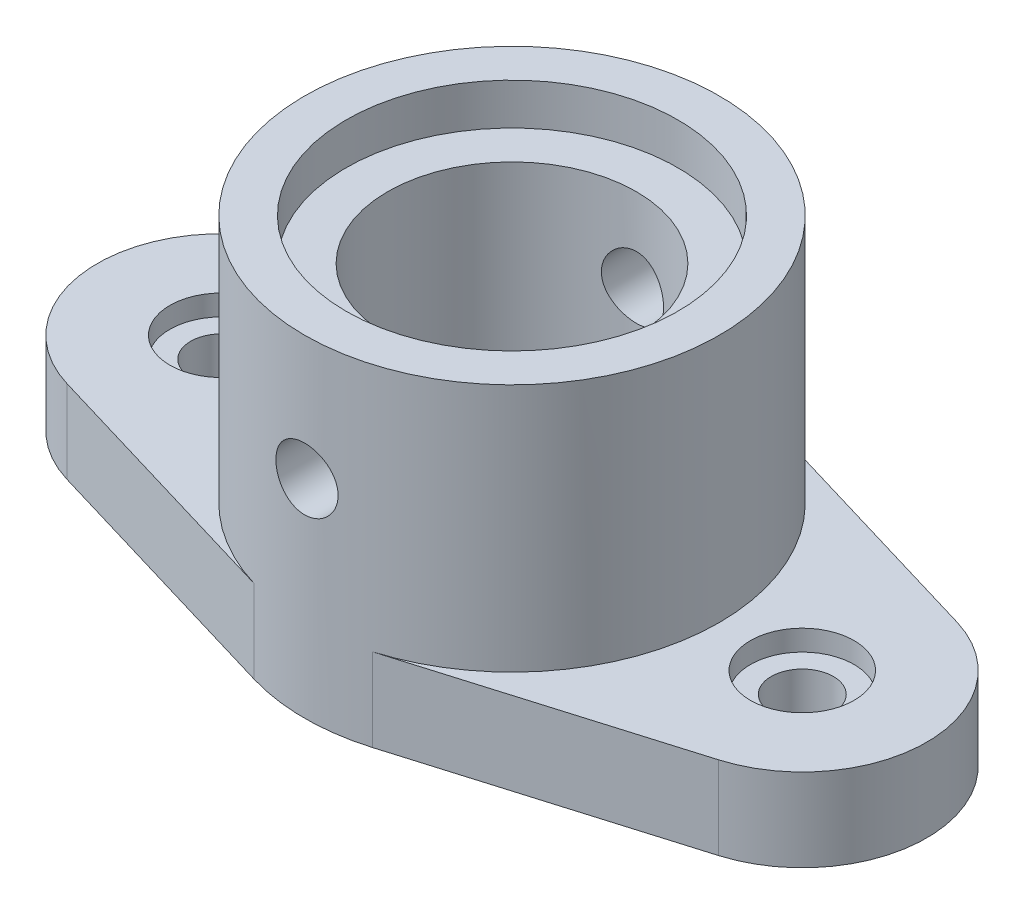
ISO-10303-21;
HEADER;
FILE_DESCRIPTION(('STEP AP214'),'2;1');
FILE_NAME('part.step','',(''),(''),'','','');
FILE_SCHEMA(('AUTOMOTIVE_DESIGN { 1 0 10303 214 1 1 1 1 }'));
ENDSEC;
DATA;
#1=APPLICATION_CONTEXT('core data for automotive mechanical design processes');
#2=APPLICATION_PROTOCOL_DEFINITION('international standard','automotive_design',2000,#1);
#3=PRODUCT_CONTEXT('',#1,'mechanical');
#4=PRODUCT('Part','Part','',(#3));
#5=PRODUCT_RELATED_PRODUCT_CATEGORY('part','',(#4));
#6=PRODUCT_DEFINITION_FORMATION('','',#4);
#7=PRODUCT_DEFINITION_CONTEXT('part definition',#1,'design');
#8=PRODUCT_DEFINITION('design','',#6,#7);
#9=PRODUCT_DEFINITION_SHAPE('','',#8);
#10=(LENGTH_UNIT() NAMED_UNIT(*) SI_UNIT(.MILLI.,.METRE.));
#11=(NAMED_UNIT(*) PLANE_ANGLE_UNIT() SI_UNIT($,.RADIAN.));
#12=(NAMED_UNIT(*) SI_UNIT($,.STERADIAN.) SOLID_ANGLE_UNIT());
#13=UNCERTAINTY_MEASURE_WITH_UNIT(LENGTH_MEASURE(1.E-05),#10,'distance_accuracy_value','');
#14=(GEOMETRIC_REPRESENTATION_CONTEXT(3) GLOBAL_UNCERTAINTY_ASSIGNED_CONTEXT((#13)) GLOBAL_UNIT_ASSIGNED_CONTEXT((#10,
#11,#12)) REPRESENTATION_CONTEXT('',''));
#15=CARTESIAN_POINT('',(0.,0.,0.));
#16=DIRECTION('',(0.,0.,1.));
#17=DIRECTION('',(1.,0.,0.));
#18=AXIS2_PLACEMENT_3D('',#15,#16,#17);
#19=CARTESIAN_POINT('',(0.,12.7,0.));
#20=DIRECTION('',(0.,-1.,0.));
#21=DIRECTION('',(0.,0.,-1.));
#22=AXIS2_PLACEMENT_3D('',#19,#20,#21);
#23=CYLINDRICAL_SURFACE('',#22,19.05);
#24=CARTESIAN_POINT('',(0.,36.5125,-19.05));
#25=CARTESIAN_POINT('',(-0.263131581526395,36.5124926157813,-19.0499955508094));
#26=CARTESIAN_POINT('',(-0.526345651112671,36.4906193262932,-19.0444938556855));
#27=CARTESIAN_POINT('',(-1.04523007797144,36.4038351446002,-19.0230796140991));
#28=CARTESIAN_POINT('',(-1.30089607381459,36.3388998597173,-19.0071611670842));
#29=CARTESIAN_POINT('',(-1.79711626917968,36.1682053702579,-18.966676136042));
#30=CARTESIAN_POINT('',(-2.03768821389025,36.062495189079,-18.9421199402354));
#31=CARTESIAN_POINT('',(-2.49768401879655,35.8134240866076,-18.886974665892));
#32=CARTESIAN_POINT('',(-2.71710716530731,35.6700618953223,-18.8563853838695));
#33=CARTESIAN_POINT('',(-3.1330961191804,35.346637492848,-18.7917903815363));
#34=CARTESIAN_POINT('',(-3.32916431594385,35.165945749505,-18.757731951953));
#35=CARTESIAN_POINT('',(-3.68855284387053,34.7743392494138,-18.6903874387445));
#36=CARTESIAN_POINT('',(-3.85186947731367,34.5634210846435,-18.6571014427033));
#37=CARTESIAN_POINT('',(-4.14345927338673,34.11348515511,-18.5945391284169));
#38=CARTESIAN_POINT('',(-4.2711757855623,33.8740964921823,-18.5653297242578));
#39=CARTESIAN_POINT('',(-4.48436018464859,33.3763987929794,-18.514996460472));
#40=CARTESIAN_POINT('',(-4.56983482602243,33.1180927891708,-18.4938713082978));
#41=CARTESIAN_POINT('',(-4.69441160685511,32.5953643932097,-18.4626401351083));
#42=CARTESIAN_POINT('',(-4.73440845195425,32.3311682050794,-18.4523218391551));
#43=CARTESIAN_POINT('',(-4.76968113583583,31.7996297934271,-18.443237258092));
#44=CARTESIAN_POINT('',(-4.76496425027248,31.5322880888025,-18.4444690935867));
#45=CARTESIAN_POINT('',(-4.71165721573104,31.0089048104085,-18.4581547751589));
#46=CARTESIAN_POINT('',(-4.66413323010524,30.7527464018476,-18.4703359004816));
#47=CARTESIAN_POINT('',(-4.52826179341698,30.2521586633574,-18.5041130320564));
#48=CARTESIAN_POINT('',(-4.4399114340703,30.0077301703832,-18.5257097090233));
#49=CARTESIAN_POINT('',(-4.22398659245054,29.5346817983995,-18.5761348665047));
#50=CARTESIAN_POINT('',(-4.0960251684645,29.3062464045681,-18.6050341471667));
#51=CARTESIAN_POINT('',(-3.80478117634744,28.8737080965221,-18.6667683193602));
#52=CARTESIAN_POINT('',(-3.64149242746804,28.6696094498865,-18.6996038991244));
#53=CARTESIAN_POINT('',(-3.27870637336286,28.2854285201703,-18.7666592071416));
#54=CARTESIAN_POINT('',(-3.07830936967659,28.1061969940552,-18.8008917059265));
#55=CARTESIAN_POINT('',(-2.64989283807423,27.7837225551771,-18.8660394071255));
#56=CARTESIAN_POINT('',(-2.4218724667227,27.6404807417132,-18.8969545081937));
#57=CARTESIAN_POINT('',(-1.9434679465634,27.3937393887376,-18.9521379939905));
#58=CARTESIAN_POINT('',(-1.69300967343736,27.2903780446922,-18.9763831840553));
#59=CARTESIAN_POINT('',(-1.17753132585364,27.1274625543721,-19.0153263644775));
#60=CARTESIAN_POINT('',(-0.912514047302775,27.0679000283724,-19.0300261810222));
#61=CARTESIAN_POINT('',(-0.382714405988323,26.9955722293507,-19.0479521018661));
#62=CARTESIAN_POINT('',(-0.118099585962555,26.9816483922109,-19.0514621988878));
#63=CARTESIAN_POINT('',(0.4096793774948,26.9978155815262,-19.0474220528589));
#64=CARTESIAN_POINT('',(0.672843649371602,27.0279026458873,-19.0398728054288));
#65=CARTESIAN_POINT('',(1.18622530336536,27.1302826341426,-19.0147442007934));
#66=CARTESIAN_POINT('',(1.43657675272579,27.2019435115394,-18.9973151353987));
#67=CARTESIAN_POINT('',(1.92169190353674,27.3847149917904,-18.9543914356345));
#68=CARTESIAN_POINT('',(2.15645402792867,27.4958295786945,-18.928895986747));
#69=CARTESIAN_POINT('',(2.60833595181471,27.7565997091771,-18.8719875266574));
#70=CARTESIAN_POINT('',(2.82506877782855,27.9069041568591,-18.8404775388889));
#71=CARTESIAN_POINT('',(3.23064699831751,28.240957960431,-18.7751881667117));
#72=CARTESIAN_POINT('',(3.41948756974008,28.424713088286,-18.7414083912834));
#73=CARTESIAN_POINT('',(3.76869505363012,28.8258312256788,-18.6743643834617));
#74=CARTESIAN_POINT('',(3.92824927969694,29.0439084570238,-18.6411331577848));
#75=CARTESIAN_POINT('',(4.20849665986831,29.5044261144376,-18.5798738886387));
#76=CARTESIAN_POINT('',(4.32919153896266,29.7468654584305,-18.5518456142307));
#77=CARTESIAN_POINT('',(4.5273957604281,30.2479256686405,-18.5044745072254));
#78=CARTESIAN_POINT('',(4.60516095934263,30.506440219894,-18.4850803532866));
#79=CARTESIAN_POINT('',(4.71597247031955,31.0334331001882,-18.457124122883));
#80=CARTESIAN_POINT('',(4.74902856223879,31.3019092369841,-18.4485596775091));
#81=CARTESIAN_POINT('',(4.7689725243161,31.8329342507806,-18.4434131133217));
#82=CARTESIAN_POINT('',(4.75715932544306,32.0954318565812,-18.4464938626329));
#83=CARTESIAN_POINT('',(4.69067285863094,32.6145648465644,-18.4635111092241));
#84=CARTESIAN_POINT('',(4.63600045202905,32.8712003484504,-18.4774473883417));
#85=CARTESIAN_POINT('',(4.48605693923534,33.3699118575155,-18.5144175271476));
#86=CARTESIAN_POINT('',(4.39102945986138,33.6120654441331,-18.5373967338792));
#87=CARTESIAN_POINT('',(4.16326610069488,34.0771650901206,-18.5898712441369));
#88=CARTESIAN_POINT('',(4.03052499085821,34.3001084798697,-18.6193674513003));
#89=CARTESIAN_POINT('',(3.72703010192323,34.7267359470801,-18.6825138879017));
#90=CARTESIAN_POINT('',(3.55537504224648,34.9297659081207,-18.7162524084177));
#91=CARTESIAN_POINT('',(3.18068125352731,35.3045618672258,-18.7835548650601));
#92=CARTESIAN_POINT('',(2.9776350825041,35.4763204306088,-18.8171187578316));
#93=CARTESIAN_POINT('',(2.54148458778074,35.7867309046925,-18.8810155668159));
#94=CARTESIAN_POINT('',(2.30790249085452,35.9247268984072,-18.911278959367));
#95=CARTESIAN_POINT('',(1.82011973894574,36.1592731948362,-18.9644313679593));
#96=CARTESIAN_POINT('',(1.56593401391164,36.2558531950591,-18.9873256650929));
#97=CARTESIAN_POINT('',(1.09350255404801,36.3904905612966,-19.0197758912061));
#98=CARTESIAN_POINT('',(0.87750704263311,36.4361451966946,-19.031032075423));
#99=CARTESIAN_POINT('',(0.441026777127695,36.4971518709997,-19.0461457161143));
#100=CARTESIAN_POINT('',(0.220542361945305,36.5125061890443,-19.0500037290659));
#101=CARTESIAN_POINT('',(0.,36.5125,-19.05));
#102=B_SPLINE_CURVE_WITH_KNOTS('',3,(#24,#25,#26,#27,#28,#29,#30,#31,#32,#33,#34,#35,#36,#37,
#38,#39,#40,#41,#42,#43,#44,#45,#46,#47,#48,#49,#50,#51,#52,#53,#54,#55,#56,#57,#58,#59,#60,#61,
#62,#63,#64,#65,#66,#67,#68,#69,#70,#71,#72,#73,#74,#75,#76,#77,#78,#79,#80,#81,#82,#83,#84,#85,
#86,#87,#88,#89,#90,#91,#92,#93,#94,#95,#96,#97,#98,#99,#100,#101),.UNSPECIFIED.,.T.,.F.,(4,2,2,
2,2,2,2,2,2,2,2,2,2,2,2,2,2,2,2,2,2,2,2,2,2,2,2,2,2,2,2,2,2,2,2,2,2,2,4),(0.,0.788586537098247,
1.57762015490038,2.36570806475838,3.1538225600376,3.95650832512915,4.75928466416695,
5.57398705957935,6.38855914212742,7.18681236945894,7.98493571018354,8.76371428007823,
9.54254833515213,10.3292442601011,11.1160779341536,11.9253476558718,12.7346420935797,
13.5467162711448,14.3586350397198,15.1497763092449,15.940846360435,16.7201937159261,
17.4996197925881,18.2928764053053,19.08627002561,19.8991381673475,20.7119702204023,
21.5199040841399,22.3276611884505,23.1122150278762,23.8967531006065,24.6766207180149,
25.456596538599,26.2569190512671,27.0574315904632,27.8724418898643,28.6868668015803,
29.3478662136656,30.0088159046189),.UNSPECIFIED.);
#103=CARTESIAN_POINT('',(0.,36.5125,-19.05));
#104=VERTEX_POINT('',#103);
#105=EDGE_CURVE('E202',#104,#104,#102,.T.);
#106=ORIENTED_EDGE('',*,*,#105,.F.);
#107=EDGE_LOOP('',(#106));
#108=FACE_BOUND('',#107,.T.);
#109=CARTESIAN_POINT('',(-4.76249999999998,31.75,18.4450831863128));
#110=CARTESIAN_POINT('',(-4.76249252971979,32.0129866805151,18.4450882066737));
#111=CARTESIAN_POINT('',(-4.74064249767301,32.2760560319826,18.4507690295781));
#112=CARTESIAN_POINT('',(-4.65395905400851,32.7946402364205,18.4728204709584));
#113=CARTESIAN_POINT('',(-4.58910062634369,33.0501506022619,18.4891973107421));
#114=CARTESIAN_POINT('',(-4.41863073529902,33.5460407402466,18.5306727035567));
#115=CARTESIAN_POINT('',(-4.31307188156279,33.7864395810098,18.5557599932532));
#116=CARTESIAN_POINT('',(-4.06435777410292,34.2461421740885,18.6118155581479));
#117=CARTESIAN_POINT('',(-3.92120092420809,34.4654450302628,18.6427840830102));
#118=CARTESIAN_POINT('',(-3.59798955402912,34.8815564342245,18.7078756465747));
#119=CARTESIAN_POINT('',(-3.4172592710762,35.0778323086668,18.7420490847188));
#120=CARTESIAN_POINT('',(-3.02548683211175,35.4376254562564,18.8092627785663));
#121=CARTESIAN_POINT('',(-2.81444184541347,35.6011396668094,18.8423029280897));
#122=CARTESIAN_POINT('',(-2.3643816080554,35.8929472658376,18.9040849156671));
#123=CARTESIAN_POINT('',(-2.1250171676517,36.0207173694476,18.9327603449813));
#124=CARTESIAN_POINT('',(-1.62737136607771,36.2340073721116,18.98200696719));
#125=CARTESIAN_POINT('',(-1.36909280243364,36.319533504899,19.0025793557193));
#126=CARTESIAN_POINT('',(-0.846503435426674,36.4442016248722,19.0329456560578));
#127=CARTESIAN_POINT('',(-0.582420830740797,36.4842481724421,19.0429494777341));
#128=CARTESIAN_POINT('',(-0.0511089006955738,36.5196597125199,19.0517829677441));
#129=CARTESIAN_POINT('',(0.216119953595025,36.5150313110593,19.0506142881424));
#130=CARTESIAN_POINT('',(0.739865077158487,36.4618749102735,19.0373907088647));
#131=CARTESIAN_POINT('',(0.99648747680006,36.4143233007724,19.0255779445931));
#132=CARTESIAN_POINT('',(1.49798840330769,36.2782397305576,18.992675435799));
#133=CARTESIAN_POINT('',(1.74286630425177,36.1897055883559,18.9715851974424));
#134=CARTESIAN_POINT('',(2.21649942542728,35.9733801028413,18.9221270598));
#135=CARTESIAN_POINT('',(2.44508897776272,35.8452412799199,18.8936951251828));
#136=CARTESIAN_POINT('',(2.87786265139683,35.553607431283,18.8326376675817));
#137=CARTESIAN_POINT('',(3.08204251709568,35.39010625439,18.8000114154095));
#138=CARTESIAN_POINT('',(3.46602384209111,35.0271548465256,18.733078747279));
#139=CARTESIAN_POINT('',(3.6450159465919,34.8268514300853,18.6987507568539));
#140=CARTESIAN_POINT('',(3.9670499905276,34.398712050398,18.6330915791081));
#141=CARTESIAN_POINT('',(4.11009024968308,34.1708748010406,18.6017605318976));
#142=CARTESIAN_POINT('',(4.35667846445952,33.6925474849688,18.5455654642112));
#143=CARTESIAN_POINT('',(4.46003156265028,33.4419529338488,18.5207335383617));
#144=CARTESIAN_POINT('',(4.62289026823328,32.9261746834122,18.4807600933877));
#145=CARTESIAN_POINT('',(4.68240525869623,32.6609941191395,18.4656165006719));
#146=CARTESIAN_POINT('',(4.75455546166982,32.1310771495645,18.4471695323144));
#147=CARTESIAN_POINT('',(4.76838735281893,31.8665140036797,18.4435639951103));
#148=CARTESIAN_POINT('',(4.75205486692836,31.3388592108107,18.4477788909977));
#149=CARTESIAN_POINT('',(4.72189453990306,31.0757674306078,18.4555982722877));
#150=CARTESIAN_POINT('',(4.61948300880315,30.5629673252715,18.4814924118399));
#151=CARTESIAN_POINT('',(4.54792855007723,30.3131104558853,18.4993972831272));
#152=CARTESIAN_POINT('',(4.36553244558201,29.8289380727898,18.5432836828994));
#153=CARTESIAN_POINT('',(4.25468614589225,29.5946244039988,18.5692661680922));
#154=CARTESIAN_POINT('',(3.99434812241928,29.1431193656635,18.6270164116714));
#155=CARTESIAN_POINT('',(3.84414094105691,28.9263540597181,18.6588876619685));
#156=CARTESIAN_POINT('',(3.51024964510031,28.5206661688632,18.7245704325042));
#157=CARTESIAN_POINT('',(3.32656002901089,28.3317481687816,18.7583822709741));
#158=CARTESIAN_POINT('',(2.92542620868976,27.9822699639024,18.8251605277554));
#159=CARTESIAN_POINT('',(2.70725242393171,27.8225375808445,18.8580846242789));
#160=CARTESIAN_POINT('',(2.24648402633339,27.5419771734579,18.9185019764907));
#161=CARTESIAN_POINT('',(2.00389068816053,27.4211471198614,18.9459955154252));
#162=CARTESIAN_POINT('',(1.50284593574432,27.2228703042243,18.9922807048151));
#163=CARTESIAN_POINT('',(1.24452402714529,27.1451115382579,19.0111347619269));
#164=CARTESIAN_POINT('',(0.717945733518322,27.034248062571,19.0382898391898));
#165=CARTESIAN_POINT('',(0.449691276008913,27.0011347351021,19.0465928959447));
#166=CARTESIAN_POINT('',(-0.0813602946863194,26.9809868546465,19.0516273180944));
#167=CARTESIAN_POINT('',(-0.34410885092567,26.9927306104331,19.0486654941594));
#168=CARTESIAN_POINT('',(-0.863762701675241,27.0591652774894,19.0321833187857));
#169=CARTESIAN_POINT('',(-1.12066816973166,27.1138549115002,19.0186632813602));
#170=CARTESIAN_POINT('',(-1.62006455725823,27.2639736966587,18.9826312396665));
#171=CARTESIAN_POINT('',(-1.86262563044135,27.3591819464097,18.9601680344264));
#172=CARTESIAN_POINT('',(-2.32846746511072,27.5874348825807,18.908615134513));
#173=CARTESIAN_POINT('',(-2.55174579152756,27.7204843385932,18.8795246046083));
#174=CARTESIAN_POINT('',(-2.97847668411597,28.0243688019066,18.8169827660237));
#175=CARTESIAN_POINT('',(-3.18132613177081,28.1960326805795,18.7834436818468));
#176=CARTESIAN_POINT('',(-3.55575403405255,28.5706638325421,18.7161796613487));
#177=CARTESIAN_POINT('',(-3.72732454817725,28.7736390304794,18.6824546800678));
#178=CARTESIAN_POINT('',(-4.03746665107208,29.2096892350773,18.6179210371421));
#179=CARTESIAN_POINT('',(-4.17536289997049,29.443255137527,18.5871785199404));
#180=CARTESIAN_POINT('',(-4.40972684498828,29.9309892705288,18.5329808804412));
#181=CARTESIAN_POINT('',(-4.50622468269461,30.1851423510219,18.5095204596068));
#182=CARTESIAN_POINT('',(-4.64068729231938,30.657373018865,18.4762096542539));
#183=CARTESIAN_POINT('',(-4.68626747496761,30.873191195389,18.4646250755416));
#184=CARTESIAN_POINT('',(-4.74717566837303,31.3093204886015,18.4490600624973));
#185=CARTESIAN_POINT('',(-4.76250625969544,31.529631220414,18.4450789795188));
#186=CARTESIAN_POINT('',(-4.76249999999998,31.75,18.4450831863128));
#187=B_SPLINE_CURVE_WITH_KNOTS('',3,(#109,#110,#111,#112,#113,#114,#115,#116,#117,#118,#119,
#120,#121,#122,#123,#124,#125,#126,#127,#128,#129,#130,#131,#132,#133,#134,#135,#136,#137,#138,
#139,#140,#141,#142,#143,#144,#145,#146,#147,#148,#149,#150,#151,#152,#153,#154,#155,#156,#157,
#158,#159,#160,#161,#162,#163,#164,#165,#166,#167,#168,#169,#170,#171,#172,#173,#174,#175,#176,
#177,#178,#179,#180,#181,#182,#183,#184,#185,#186),.UNSPECIFIED.,.T.,.F.,(4,2,2,2,2,2,2,2,2,2,2,
2,2,2,2,2,2,2,2,2,2,2,2,2,2,2,2,2,2,2,2,2,2,2,2,2,2,2,4),(0.,0.788150776507333,1.5767603874216,
2.36435403525127,3.15198112469186,3.95523632737618,4.75856658419144,5.57310600638036,
6.38752519508709,7.18544570646133,7.98324823208766,8.76334790422441,9.54348910560714,
10.3306792545471,11.1180064431828,11.9266423881949,12.7353161193562,13.5479110297825,
14.3603319625161,15.1512950993064,15.9421854229939,16.7201355655679,17.4981778832205,
18.2914832137594,19.0849190099026,19.8982075550318,20.7114536695999,21.5187289871145,
22.3258484568596,23.1111446488705,23.8964174861739,24.6774628986049,25.4586067994527,
26.2584646900309,27.0585253514654,27.8735118924443,28.6879040422423,29.3483886079363,
30.008816825854),.UNSPECIFIED.);
#188=CARTESIAN_POINT('',(-4.76249999999998,31.75,18.4450831863128));
#189=VERTEX_POINT('',#188);
#190=EDGE_CURVE('E197',#189,#189,#187,.T.);
#191=ORIENTED_EDGE('',*,*,#190,.F.);
#192=EDGE_LOOP('',(#191));
#193=FACE_BOUND('',#192,.T.);
#194=CARTESIAN_POINT('',(0.,0.,0.));
#195=DIRECTION('',(0.,1.,0.));
#196=DIRECTION('',(0.,0.,1.));
#197=AXIS2_PLACEMENT_3D('',#194,#195,#196);
#198=CIRCLE('',#197,19.05);
#199=CARTESIAN_POINT('',(0.,0.,19.05));
#200=VERTEX_POINT('',#199);
#201=EDGE_CURVE('E157',#200,#200,#198,.T.);
#202=ORIENTED_EDGE('',*,*,#201,.F.);
#203=EDGE_LOOP('',(#202));
#204=FACE_BOUND('',#203,.T.);
#205=CARTESIAN_POINT('',(0.,44.45,0.));
#206=DIRECTION('',(0.,1.,0.));
#207=DIRECTION('',(0.,0.,1.));
#208=AXIS2_PLACEMENT_3D('',#205,#206,#207);
#209=CIRCLE('',#208,19.05);
#210=CARTESIAN_POINT('',(0.,44.45,19.05));
#211=VERTEX_POINT('',#210);
#212=EDGE_CURVE('E172',#211,#211,#209,.T.);
#213=ORIENTED_EDGE('',*,*,#212,.T.);
#214=EDGE_LOOP('',(#213));
#215=FACE_BOUND('',#214,.T.);
#216=ADVANCED_FACE('F38',(#108,#193,#204,#215),#23,.F.);
#217=CARTESIAN_POINT('',(0.,12.7,0.));
#218=DIRECTION('',(0.,1.,0.));
#219=DIRECTION('',(0.,0.,1.));
#220=AXIS2_PLACEMENT_3D('',#217,#218,#219);
#221=PLANE('',#220);
#222=CARTESIAN_POINT('',(44.45,12.7,0.));
#223=DIRECTION('',(0.,1.,0.));
#224=DIRECTION('',(0.,0.,1.));
#225=AXIS2_PLACEMENT_3D('',#222,#223,#224);
#226=CIRCLE('',#225,7.9375);
#227=CARTESIAN_POINT('',(44.45,12.7,7.9375));
#228=VERTEX_POINT('',#227);
#229=EDGE_CURVE('E269',#228,#228,#226,.T.);
#230=ORIENTED_EDGE('',*,*,#229,.F.);
#231=EDGE_LOOP('',(#230));
#232=FACE_BOUND('',#231,.T.);
#233=CARTESIAN_POINT('',(0.,12.7,0.));
#234=DIRECTION('',(0.,1.,0.));
#235=DIRECTION('',(0.,0.,1.));
#236=AXIS2_PLACEMENT_3D('',#233,#234,#235);
#237=CIRCLE('',#236,31.75);
#238=CARTESIAN_POINT('',(9.07142857142857,12.7,30.4264964081221));
#239=VERTEX_POINT('',#238);
#240=CARTESIAN_POINT('',(9.07142857142857,12.7,-30.4264964081221));
#241=VERTEX_POINT('',#240);
#242=EDGE_CURVE('E174',#239,#241,#237,.T.);
#243=ORIENTED_EDGE('',*,*,#242,.F.);
#244=DIRECTION('',(-0.95831484749991,0.,0.285714285714286));
#245=VECTOR('',#244,1.);
#246=CARTESIAN_POINT('',(9.07142857142856,12.7,30.4264964081221));
#247=LINE('',#246,#245);
#248=CARTESIAN_POINT('',(49.8928571428571,12.7,18.2558978448733));
#249=VERTEX_POINT('',#248);
#250=EDGE_CURVE('E124',#249,#239,#247,.T.);
#251=ORIENTED_EDGE('',*,*,#250,.F.);
#252=CARTESIAN_POINT('',(44.45,12.7,0.));
#253=DIRECTION('',(0.,1.,0.));
#254=DIRECTION('',(0.,0.,1.));
#255=AXIS2_PLACEMENT_3D('',#252,#253,#254);
#256=CIRCLE('',#255,19.05);
#257=CARTESIAN_POINT('',(49.8928571428571,12.7,-18.2558978448733));
#258=VERTEX_POINT('',#257);
#259=EDGE_CURVE('E117',#249,#258,#256,.T.);
#260=ORIENTED_EDGE('',*,*,#259,.T.);
#261=DIRECTION('',(-0.95831484749991,0.,-0.285714285714286));
#262=VECTOR('',#261,1.);
#263=CARTESIAN_POINT('',(9.07142857142858,12.7,-30.4264964081221));
#264=LINE('',#263,#262);
#265=EDGE_CURVE('E122',#258,#241,#264,.T.);
#266=ORIENTED_EDGE('',*,*,#265,.T.);
#267=EDGE_LOOP('',(#243,#251,#260,#266));
#268=FACE_BOUND('',#267,.T.);
#269=ADVANCED_FACE('F120',(#232,#268),#221,.T.);
#270=CARTESIAN_POINT('',(-9.07142857142857,12.7,-30.4264964081221));
#271=DIRECTION('',(-0.285714285714286,0.,-0.95831484749991));
#272=DIRECTION('',(-0.95831484749991,0.,0.285714285714286));
#273=AXIS2_PLACEMENT_3D('',#270,#271,#272);
#274=PLANE('',#273);
#275=DIRECTION('',(0.95831484749991,0.,-0.285714285714286));
#276=VECTOR('',#275,1.);
#277=CARTESIAN_POINT('',(-9.07142857142857,0.,-30.4264964081221));
#278=LINE('',#277,#276);
#279=CARTESIAN_POINT('',(-49.8928571428571,0.,-18.2558978448733));
#280=VERTEX_POINT('',#279);
#281=CARTESIAN_POINT('',(-9.07142857142857,0.,-30.4264964081221));
#282=VERTEX_POINT('',#281);
#283=EDGE_CURVE('E140',#280,#282,#278,.T.);
#284=ORIENTED_EDGE('',*,*,#283,.F.);
#285=DIRECTION('',(0.,-1.,0.));
#286=VECTOR('',#285,1.);
#287=CARTESIAN_POINT('',(-49.8928571428571,12.7,-18.2558978448733));
#288=LINE('',#287,#286);
#289=CARTESIAN_POINT('',(-49.8928571428571,12.7,-18.2558978448733));
#290=VERTEX_POINT('',#289);
#291=EDGE_CURVE('E103',#290,#280,#288,.T.);
#292=ORIENTED_EDGE('',*,*,#291,.F.);
#293=DIRECTION('',(0.95831484749991,0.,-0.285714285714286));
#294=VECTOR('',#293,1.);
#295=CARTESIAN_POINT('',(-9.07142857142857,12.7,-30.4264964081221));
#296=LINE('',#295,#294);
#297=CARTESIAN_POINT('',(-9.07142857142857,12.7,-30.4264964081221));
#298=VERTEX_POINT('',#297);
#299=EDGE_CURVE('E159',#290,#298,#296,.T.);
#300=ORIENTED_EDGE('',*,*,#299,.T.);
#301=DIRECTION('',(0.,-1.,0.));
#302=VECTOR('',#301,1.);
#303=CARTESIAN_POINT('',(-9.07142857142857,12.7,-30.4264964081221));
#304=LINE('',#303,#302);
#305=EDGE_CURVE('E98',#298,#282,#304,.T.);
#306=ORIENTED_EDGE('',*,*,#305,.T.);
#307=EDGE_LOOP('',(#284,#292,#300,#306));
#308=FACE_BOUND('',#307,.T.);
#309=ADVANCED_FACE('F40',(#308),#274,.T.);
#310=CARTESIAN_POINT('',(-44.45,12.7,0.));
#311=DIRECTION('',(0.,-1.,0.));
#312=DIRECTION('',(0.,0.,-1.));
#313=AXIS2_PLACEMENT_3D('',#310,#311,#312);
#314=CYLINDRICAL_SURFACE('',#313,19.05);
#315=CARTESIAN_POINT('',(-44.45,0.,0.));
#316=DIRECTION('',(0.,1.,0.));
#317=DIRECTION('',(0.,0.,1.));
#318=AXIS2_PLACEMENT_3D('',#315,#316,#317);
#319=CIRCLE('',#318,19.05);
#320=CARTESIAN_POINT('',(-49.8928571428571,0.,18.2558978448733));
#321=VERTEX_POINT('',#320);
#322=EDGE_CURVE('E143',#280,#321,#319,.T.);
#323=ORIENTED_EDGE('',*,*,#322,.T.);
#324=DIRECTION('',(0.,-1.,0.));
#325=VECTOR('',#324,1.);
#326=CARTESIAN_POINT('',(-49.8928571428571,12.7,18.2558978448733));
#327=LINE('',#326,#325);
#328=CARTESIAN_POINT('',(-49.8928571428571,12.7,18.2558978448733));
#329=VERTEX_POINT('',#328);
#330=EDGE_CURVE('E168',#329,#321,#327,.T.);
#331=ORIENTED_EDGE('',*,*,#330,.F.);
#332=CARTESIAN_POINT('',(-44.45,12.7,0.));
#333=DIRECTION('',(0.,1.,0.));
#334=DIRECTION('',(0.,0.,1.));
#335=AXIS2_PLACEMENT_3D('',#332,#333,#334);
#336=CIRCLE('',#335,19.05);
#337=EDGE_CURVE('E290',#290,#329,#336,.T.);
#338=ORIENTED_EDGE('',*,*,#337,.F.);
#339=ORIENTED_EDGE('',*,*,#291,.T.);
#340=EDGE_LOOP('',(#323,#331,#338,#339));
#341=FACE_BOUND('',#340,.T.);
#342=ADVANCED_FACE('F309',(#341),#314,.T.);
#343=CARTESIAN_POINT('',(-9.07142857142857,12.7,30.4264964081221));
#344=DIRECTION('',(0.285714285714286,0.,-0.95831484749991));
#345=DIRECTION('',(-0.95831484749991,0.,-0.285714285714286));
#346=AXIS2_PLACEMENT_3D('',#343,#344,#345);
#347=PLANE('',#346);
#348=DIRECTION('',(0.95831484749991,0.,0.285714285714286));
#349=VECTOR('',#348,1.);
#350=CARTESIAN_POINT('',(-9.07142857142857,0.,30.4264964081221));
#351=LINE('',#350,#349);
#352=CARTESIAN_POINT('',(-9.07142857142857,0.,30.4264964081221));
#353=VERTEX_POINT('',#352);
#354=EDGE_CURVE('E146',#321,#353,#351,.T.);
#355=ORIENTED_EDGE('',*,*,#354,.T.);
#356=DIRECTION('',(0.,-1.,0.));
#357=VECTOR('',#356,1.);
#358=CARTESIAN_POINT('',(-9.07142857142857,12.7,30.4264964081221));
#359=LINE('',#358,#357);
#360=CARTESIAN_POINT('',(-9.07142857142857,12.7,30.4264964081221));
#361=VERTEX_POINT('',#360);
#362=EDGE_CURVE('E165',#361,#353,#359,.T.);
#363=ORIENTED_EDGE('',*,*,#362,.F.);
#364=DIRECTION('',(0.95831484749991,0.,0.285714285714286));
#365=VECTOR('',#364,1.);
#366=CARTESIAN_POINT('',(-9.07142857142857,12.7,30.4264964081221));
#367=LINE('',#366,#365);
#368=EDGE_CURVE('E292',#329,#361,#367,.T.);
#369=ORIENTED_EDGE('',*,*,#368,.F.);
#370=ORIENTED_EDGE('',*,*,#330,.T.);
#371=EDGE_LOOP('',(#355,#363,#369,#370));
#372=FACE_BOUND('',#371,.T.);
#373=ADVANCED_FACE('F311',(#372),#347,.F.);
#374=CARTESIAN_POINT('',(9.07142857142856,12.7,30.4264964081221));
#375=DIRECTION('',(0.285714285714286,0.,0.95831484749991));
#376=DIRECTION('',(0.95831484749991,0.,-0.285714285714286));
#377=AXIS2_PLACEMENT_3D('',#374,#375,#376);
#378=PLANE('',#377);
#379=DIRECTION('',(-0.95831484749991,0.,0.285714285714286));
#380=VECTOR('',#379,1.);
#381=CARTESIAN_POINT('',(9.07142857142856,0.,30.4264964081221));
#382=LINE('',#381,#380);
#383=CARTESIAN_POINT('',(49.8928571428571,0.,18.2558978448733));
#384=VERTEX_POINT('',#383);
#385=CARTESIAN_POINT('',(9.07142857142857,0.,30.4264964081221));
#386=VERTEX_POINT('',#385);
#387=EDGE_CURVE('E151',#384,#386,#382,.T.);
#388=ORIENTED_EDGE('',*,*,#387,.F.);
#389=DIRECTION('',(0.,-1.,0.));
#390=VECTOR('',#389,1.);
#391=CARTESIAN_POINT('',(49.8928571428571,12.7,18.2558978448733));
#392=LINE('',#391,#390);
#393=EDGE_CURVE('E131',#249,#384,#392,.T.);
#394=ORIENTED_EDGE('',*,*,#393,.F.);
#395=ORIENTED_EDGE('',*,*,#250,.T.);
#396=DIRECTION('',(0.,-1.,0.));
#397=VECTOR('',#396,1.);
#398=CARTESIAN_POINT('',(9.07142857142857,12.7,30.4264964081221));
#399=LINE('',#398,#397);
#400=EDGE_CURVE('E163',#239,#386,#399,.T.);
#401=ORIENTED_EDGE('',*,*,#400,.T.);
#402=EDGE_LOOP('',(#388,#394,#395,#401));
#403=FACE_BOUND('',#402,.T.);
#404=ADVANCED_FACE('F296',(#403),#378,.T.);
#405=CARTESIAN_POINT('',(44.45,12.7,0.));
#406=DIRECTION('',(0.,-1.,0.));
#407=DIRECTION('',(0.,0.,-1.));
#408=AXIS2_PLACEMENT_3D('',#405,#406,#407);
#409=CYLINDRICAL_SURFACE('',#408,19.05);
#410=CARTESIAN_POINT('',(44.45,0.,0.));
#411=DIRECTION('',(0.,1.,0.));
#412=DIRECTION('',(0.,0.,1.));
#413=AXIS2_PLACEMENT_3D('',#410,#411,#412);
#414=CIRCLE('',#413,19.05);
#415=CARTESIAN_POINT('',(49.8928571428571,0.,-18.2558978448733));
#416=VERTEX_POINT('',#415);
#417=EDGE_CURVE('E130',#384,#416,#414,.T.);
#418=ORIENTED_EDGE('',*,*,#417,.T.);
#419=DIRECTION('',(0.,-1.,0.));
#420=VECTOR('',#419,1.);
#421=CARTESIAN_POINT('',(49.8928571428571,12.7,-18.2558978448733));
#422=LINE('',#421,#420);
#423=EDGE_CURVE('E127',#258,#416,#422,.T.);
#424=ORIENTED_EDGE('',*,*,#423,.F.);
#425=ORIENTED_EDGE('',*,*,#259,.F.);
#426=ORIENTED_EDGE('',*,*,#393,.T.);
#427=EDGE_LOOP('',(#418,#424,#425,#426));
#428=FACE_BOUND('',#427,.T.);
#429=ADVANCED_FACE('F128',(#428),#409,.T.);
#430=CARTESIAN_POINT('',(9.07142857142858,12.7,-30.4264964081221));
#431=DIRECTION('',(-0.285714285714286,0.,0.95831484749991));
#432=DIRECTION('',(0.95831484749991,0.,0.285714285714286));
#433=AXIS2_PLACEMENT_3D('',#430,#431,#432);
#434=PLANE('',#433);
#435=DIRECTION('',(-0.95831484749991,0.,-0.285714285714286));
#436=VECTOR('',#435,1.);
#437=CARTESIAN_POINT('',(9.07142857142858,0.,-30.4264964081221));
#438=LINE('',#437,#436);
#439=CARTESIAN_POINT('',(9.07142857142857,0.,-30.4264964081221));
#440=VERTEX_POINT('',#439);
#441=EDGE_CURVE('E91',#416,#440,#438,.T.);
#442=ORIENTED_EDGE('',*,*,#441,.T.);
#443=DIRECTION('',(0.,-1.,0.));
#444=VECTOR('',#443,1.);
#445=CARTESIAN_POINT('',(9.07142857142857,12.7,-30.4264964081221));
#446=LINE('',#445,#444);
#447=EDGE_CURVE('E132',#241,#440,#446,.T.);
#448=ORIENTED_EDGE('',*,*,#447,.F.);
#449=ORIENTED_EDGE('',*,*,#265,.F.);
#450=ORIENTED_EDGE('',*,*,#423,.T.);
#451=EDGE_LOOP('',(#442,#448,#449,#450));
#452=FACE_BOUND('',#451,.T.);
#453=ADVANCED_FACE('F134',(#452),#434,.F.);
#454=CARTESIAN_POINT('',(0.,12.7,0.));
#455=DIRECTION('',(0.,-1.,0.));
#456=DIRECTION('',(0.,0.,-1.));
#457=AXIS2_PLACEMENT_3D('',#454,#455,#456);
#458=CYLINDRICAL_SURFACE('',#457,31.75);
#459=CARTESIAN_POINT('',(0.,36.5125,-31.75));
#460=CARTESIAN_POINT('',(-0.265911153729213,36.5124890341366,-31.7499957382387));
#461=CARTESIAN_POINT('',(-0.531976600135765,36.490154347331,-31.746624420551));
#462=CARTESIAN_POINT('',(-1.05667056888384,36.4014283400547,-31.7335000321487));
#463=CARTESIAN_POINT('',(-1.31529159399317,36.3349941226499,-31.7237407477965));
#464=CARTESIAN_POINT('',(-1.8174274237544,36.1600987967278,-31.6989371487199));
#465=CARTESIAN_POINT('',(-2.06095348485008,36.0516694525686,-31.6838968292767));
#466=CARTESIAN_POINT('',(-2.52631711091692,35.7959393953514,-31.6501931101972));
#467=CARTESIAN_POINT('',(-2.74815768225246,35.6486440809749,-31.6315302138505));
#468=CARTESIAN_POINT('',(-3.16562333460974,35.3181371838159,-31.5924936789786));
#469=CARTESIAN_POINT('',(-3.36105446731595,35.1346819015389,-31.572109001018));
#470=CARTESIAN_POINT('',(-3.7184803287391,34.737587087762,-31.5320127909803));
#471=CARTESIAN_POINT('',(-3.88047313416569,34.5239458212282,-31.5123012976775));
#472=CARTESIAN_POINT('',(-4.16717891162317,34.0712404568161,-31.4756761093145));
#473=CARTESIAN_POINT('',(-4.29170423843124,33.8320562658342,-31.4587766802072));
#474=CARTESIAN_POINT('',(-4.49874107143101,33.3358717944508,-31.429839708974));
#475=CARTESIAN_POINT('',(-4.58125486748091,33.0788724859381,-31.4178019018705));
#476=CARTESIAN_POINT('',(-4.70132406186541,32.5563927170573,-31.4000596349429));
#477=CARTESIAN_POINT('',(-4.73921149058642,32.2909901759295,-31.3943084247847));
#478=CARTESIAN_POINT('',(-4.76998106307733,31.7575369229904,-31.389648579816));
#479=CARTESIAN_POINT('',(-4.76286579091801,31.4894863641116,-31.3907395521249));
#480=CARTESIAN_POINT('',(-4.70410328071249,30.9606915703836,-31.399598057689));
#481=CARTESIAN_POINT('',(-4.65282584570605,30.6999051784108,-31.4073101456792));
#482=CARTESIAN_POINT('',(-4.50777347756854,30.1906801288329,-31.4284553080122));
#483=CARTESIAN_POINT('',(-4.41399734222552,29.9422418207536,-31.4418885441953));
#484=CARTESIAN_POINT('',(-4.18622491206911,29.4636400461769,-31.473023653569));
#485=CARTESIAN_POINT('',(-4.05207197849151,29.2335522481317,-31.4907420973372));
#486=CARTESIAN_POINT('',(-3.74746561684429,28.7990134083924,-31.5284392154919));
#487=CARTESIAN_POINT('',(-3.57700980629366,28.5945640506948,-31.5484180381819));
#488=CARTESIAN_POINT('',(-3.20260640523435,28.2149624271514,-31.5886297695347));
#489=CARTESIAN_POINT('',(-2.99834087161334,28.0401236558409,-31.6088632208319));
#490=CARTESIAN_POINT('',(-2.56320001041403,27.7271609079395,-31.6471188128387));
#491=CARTESIAN_POINT('',(-2.33232456631743,27.5890370921231,-31.6651409438647));
#492=CARTESIAN_POINT('',(-1.85024584932844,27.353408950364,-31.6969621198362));
#493=CARTESIAN_POINT('',(-1.59903057713177,27.2559288134071,-31.7107586486323));
#494=CARTESIAN_POINT('',(-1.08354235439641,27.104627687749,-31.7325530751869));
#495=CARTESIAN_POINT('',(-0.819270287899498,27.0508037474856,-31.7405513649561));
#496=CARTESIAN_POINT('',(-0.28787587726857,26.988759745332,-31.7497962010004));
#497=CARTESIAN_POINT('',(-0.0208049236887375,26.9801086908707,-31.7511065538698));
#498=CARTESIAN_POINT('',(0.510973951577752,27.0075120418625,-31.7470015622334));
#499=CARTESIAN_POINT('',(0.775681946162464,27.0435650633462,-31.7415864259385));
#500=CARTESIAN_POINT('',(1.29391533009472,27.1589947680637,-31.7246783785368));
#501=CARTESIAN_POINT('',(1.54748853277849,27.238161474898,-31.7132149328535));
#502=CARTESIAN_POINT('',(2.03776249369152,27.4373498669411,-31.6854914821532));
#503=CARTESIAN_POINT('',(2.27446245892444,27.5573734707843,-31.6692312518847));
#504=CARTESIAN_POINT('',(2.72616605925185,27.8358797629903,-31.6335626683808));
#505=CARTESIAN_POINT('',(2.94099935640572,27.9946358445406,-31.6141322766492));
#506=CARTESIAN_POINT('',(3.34112766233921,28.3457199519213,-31.5743546506362));
#507=CARTESIAN_POINT('',(3.52642095321905,28.5380499288808,-31.554007363121));
#508=CARTESIAN_POINT('',(3.86377767239095,28.9527409678354,-31.5144868916677));
#509=CARTESIAN_POINT('',(4.01555219073061,29.1753382874934,-31.4953248685584));
#510=CARTESIAN_POINT('',(4.27955485434104,29.6431209286249,-31.4605422065807));
#511=CARTESIAN_POINT('',(4.39178406809183,29.8883056395807,-31.4449214720337));
#512=CARTESIAN_POINT('',(4.57306258753519,30.3934416692534,-31.4190707980245));
#513=CARTESIAN_POINT('',(4.64226392924691,30.6533374135837,-31.4088218979544));
#514=CARTESIAN_POINT('',(4.73600619667536,31.1812273740065,-31.3948248879552));
#515=CARTESIAN_POINT('',(4.76055020656235,31.4492210295331,-31.3910763290937));
#516=CARTESIAN_POINT('',(4.7642077267547,31.9828197760276,-31.3905211853942));
#517=CARTESIAN_POINT('',(4.74377550631216,32.2484217925782,-31.3936451860887));
#518=CARTESIAN_POINT('',(4.65903403803401,32.7723667110522,-31.4063323044048));
#519=CARTESIAN_POINT('',(4.59472486052639,33.03070962461,-31.4158954117055));
#520=CARTESIAN_POINT('',(4.42421560921761,33.532677036094,-31.4403589540654));
#521=CARTESIAN_POINT('',(4.31804728604696,33.7763125286262,-31.4552553429854));
#522=CARTESIAN_POINT('',(4.0668786976433,34.2423865373226,-31.488711932207));
#523=CARTESIAN_POINT('',(3.92187711754267,34.4648243354016,-31.5072722565615));
#524=CARTESIAN_POINT('',(3.59550772067845,34.8844967090712,-31.5461886018368));
#525=CARTESIAN_POINT('',(3.41380346701382,35.0814682330594,-31.5665601802525));
#526=CARTESIAN_POINT('',(3.01989757043799,35.4422854614513,-31.6066737952457));
#527=CARTESIAN_POINT('',(2.80768884851423,35.6061234554293,-31.6264156843916));
#528=CARTESIAN_POINT('',(2.35742387145131,35.8968283732284,-31.663169648849));
#529=CARTESIAN_POINT('',(2.11923178122811,36.0234868467568,-31.68016610134));
#530=CARTESIAN_POINT('',(1.62481218803968,36.2348097907068,-31.709360914494));
#531=CARTESIAN_POINT('',(1.36860367978203,36.3195177534204,-31.7215642417128));
#532=CARTESIAN_POINT('',(0.926038686048616,36.4253187631046,-31.7370123215528));
#533=CARTESIAN_POINT('',(0.742413848847506,36.4579617598857,-31.7418576864509));
#534=CARTESIAN_POINT('',(0.372551234830396,36.5015560852376,-31.7483529988457));
#535=CARTESIAN_POINT('',(0.186313490511774,36.5125076833493,-31.7500029860486));
#536=CARTESIAN_POINT('',(0.,36.5125,-31.75));
#537=B_SPLINE_CURVE_WITH_KNOTS('',3,(#459,#460,#461,#462,#463,#464,#465,#466,#467,#468,#469,
#470,#471,#472,#473,#474,#475,#476,#477,#478,#479,#480,#481,#482,#483,#484,#485,#486,#487,#488,
#489,#490,#491,#492,#493,#494,#495,#496,#497,#498,#499,#500,#501,#502,#503,#504,#505,#506,#507,
#508,#509,#510,#511,#512,#513,#514,#515,#516,#517,#518,#519,#520,#521,#522,#523,#524,#525,#526,
#527,#528,#529,#530,#531,#532,#533,#534,#535,#536),.UNSPECIFIED.,.T.,.F.,(4,2,2,2,2,2,2,2,2,2,2,
2,2,2,2,2,2,2,2,2,2,2,2,2,2,2,2,2,2,2,2,2,2,2,2,2,2,2,4),(0.,0.797052650975527,1.59488175730005,
2.39210857487677,3.18922471182736,3.99190896234477,4.7946393684294,5.60132555105313,
6.40796776015979,7.20856967623808,8.00912562189267,8.80304237596492,9.59698158991894,
10.394041425368,11.1911535862959,11.9962387473592,12.8013274338277,13.6068945852697,
14.4124072683904,15.21022035878,16.0080087507191,16.8019459796688,17.5959204969466,
18.3956702201717,19.1954664359089,20.0019083890633,20.8083285511803,21.611882844765,
22.4153816403553,23.2108022022887,24.0062214892886,24.8010385989966,25.5958826240733,
26.3983733514115,27.2010506101322,28.0081457674652,28.8144024060507,29.3728728003271,
29.9313362549144),.UNSPECIFIED.);
#538=CARTESIAN_POINT('',(0.,36.5125,-31.75));
#539=VERTEX_POINT('',#538);
#540=EDGE_CURVE('E11',#539,#539,#537,.T.);
#541=ORIENTED_EDGE('',*,*,#540,.T.);
#542=EDGE_LOOP('',(#541));
#543=FACE_BOUND('',#542,.T.);
#544=CARTESIAN_POINT('',(0.,26.9875,31.75));
#545=CARTESIAN_POINT('',(-0.265911153729212,26.9875109658634,31.7499957382387));
#546=CARTESIAN_POINT('',(-0.531976600135766,27.009845652669,31.746624420551));
#547=CARTESIAN_POINT('',(-1.05667056888384,27.0985716599452,31.7335000321487));
#548=CARTESIAN_POINT('',(-1.31529159399317,27.1650058773501,31.7237407477965));
#549=CARTESIAN_POINT('',(-1.8174274237544,27.3399012032722,31.6989371487199));
#550=CARTESIAN_POINT('',(-2.06095348485008,27.4483305474314,31.6838968292767));
#551=CARTESIAN_POINT('',(-2.52631711091692,27.7040606046486,31.6501931101972));
#552=CARTESIAN_POINT('',(-2.74815768225246,27.8513559190251,31.6315302138505));
#553=CARTESIAN_POINT('',(-3.16562333460974,28.1818628161841,31.5924936789786));
#554=CARTESIAN_POINT('',(-3.36105446731595,28.3653180984611,31.572109001018));
#555=CARTESIAN_POINT('',(-3.7184803287391,28.762412912238,31.5320127909803));
#556=CARTESIAN_POINT('',(-3.88047313416569,28.9760541787718,31.5123012976775));
#557=CARTESIAN_POINT('',(-4.16717891162317,29.4287595431839,31.4756761093145));
#558=CARTESIAN_POINT('',(-4.29170423843124,29.6679437341658,31.4587766802072));
#559=CARTESIAN_POINT('',(-4.49874107143101,30.1641282055492,31.429839708974));
#560=CARTESIAN_POINT('',(-4.58125486748091,30.4211275140619,31.4178019018705));
#561=CARTESIAN_POINT('',(-4.70132406186541,30.9436072829427,31.4000596349429));
#562=CARTESIAN_POINT('',(-4.73921149058642,31.2090098240705,31.3943084247847));
#563=CARTESIAN_POINT('',(-4.76998106307733,31.7424630770096,31.389648579816));
#564=CARTESIAN_POINT('',(-4.76286579091801,32.0105136358884,31.3907395521249));
#565=CARTESIAN_POINT('',(-4.70410328071249,32.5393084296164,31.399598057689));
#566=CARTESIAN_POINT('',(-4.65282584570605,32.8000948215893,31.4073101456792));
#567=CARTESIAN_POINT('',(-4.50777347756854,33.3093198711671,31.4284553080122));
#568=CARTESIAN_POINT('',(-4.41399734222551,33.5577581792464,31.4418885441953));
#569=CARTESIAN_POINT('',(-4.18622491206911,34.0363599538231,31.473023653569));
#570=CARTESIAN_POINT('',(-4.05207197849151,34.2664477518683,31.4907420973372));
#571=CARTESIAN_POINT('',(-3.74746561684429,34.7009865916076,31.5284392154919));
#572=CARTESIAN_POINT('',(-3.57700980629367,34.9054359493052,31.5484180381819));
#573=CARTESIAN_POINT('',(-3.20260640523435,35.2850375728486,31.5886297695347));
#574=CARTESIAN_POINT('',(-2.99834087161334,35.4598763441591,31.6088632208319));
#575=CARTESIAN_POINT('',(-2.56320001041403,35.7728390920605,31.6471188128387));
#576=CARTESIAN_POINT('',(-2.33232456631743,35.9109629078769,31.6651409438647));
#577=CARTESIAN_POINT('',(-1.85024584932844,36.146591049636,31.6969621198362));
#578=CARTESIAN_POINT('',(-1.59903057713177,36.2440711865929,31.7107586486323));
#579=CARTESIAN_POINT('',(-1.08354235439641,36.3953723122511,31.7325530751869));
#580=CARTESIAN_POINT('',(-0.819270287899498,36.4491962525144,31.7405513649561));
#581=CARTESIAN_POINT('',(-0.28787587726857,36.511240254668,31.7497962010004));
#582=CARTESIAN_POINT('',(-0.0208049236887378,36.5198913091293,31.7511065538698));
#583=CARTESIAN_POINT('',(0.510973951577752,36.4924879581375,31.7470015622334));
#584=CARTESIAN_POINT('',(0.775681946162463,36.4564349366538,31.7415864259385));
#585=CARTESIAN_POINT('',(1.29391533009472,36.3410052319363,31.7246783785368));
#586=CARTESIAN_POINT('',(1.54748853277849,36.261838525102,31.7132149328535));
#587=CARTESIAN_POINT('',(2.03776249369152,36.0626501330589,31.6854914821532));
#588=CARTESIAN_POINT('',(2.27446245892444,35.9426265292157,31.6692312518847));
#589=CARTESIAN_POINT('',(2.72616605925185,35.6641202370097,31.6335626683808));
#590=CARTESIAN_POINT('',(2.94099935640572,35.5053641554594,31.6141322766492));
#591=CARTESIAN_POINT('',(3.34112766233921,35.1542800480787,31.5743546506362));
#592=CARTESIAN_POINT('',(3.52642095321905,34.9619500711192,31.554007363121));
#593=CARTESIAN_POINT('',(3.86377767239095,34.5472590321646,31.5144868916677));
#594=CARTESIAN_POINT('',(4.01555219073061,34.3246617125066,31.4953248685584));
#595=CARTESIAN_POINT('',(4.27955485434104,33.8568790713751,31.4605422065807));
#596=CARTESIAN_POINT('',(4.39178406809183,33.6116943604193,31.4449214720337));
#597=CARTESIAN_POINT('',(4.57306258753519,33.1065583307466,31.4190707980245));
#598=CARTESIAN_POINT('',(4.64226392924692,32.8466625864163,31.4088218979544));
#599=CARTESIAN_POINT('',(4.73600619667536,32.3187726259935,31.3948248879552));
#600=CARTESIAN_POINT('',(4.76055020656235,32.0507789704669,31.3910763290937));
#601=CARTESIAN_POINT('',(4.7642077267547,31.5171802239724,31.3905211853942));
#602=CARTESIAN_POINT('',(4.74377550631217,31.2515782074218,31.3936451860887));
#603=CARTESIAN_POINT('',(4.65903403803401,30.7276332889478,31.4063323044048));
#604=CARTESIAN_POINT('',(4.5947248605264,30.46929037539,31.4158954117055));
#605=CARTESIAN_POINT('',(4.42421560921761,29.967322963906,31.4403589540654));
#606=CARTESIAN_POINT('',(4.31804728604696,29.7236874713738,31.4552553429854));
#607=CARTESIAN_POINT('',(4.0668786976433,29.2576134626774,31.488711932207));
#608=CARTESIAN_POINT('',(3.92187711754268,29.0351756645984,31.5072722565615));
#609=CARTESIAN_POINT('',(3.59550772067845,28.6155032909288,31.5461886018368));
#610=CARTESIAN_POINT('',(3.41380346701382,28.4185317669406,31.5665601802525));
#611=CARTESIAN_POINT('',(3.01989757043799,28.0577145385487,31.6066737952457));
#612=CARTESIAN_POINT('',(2.80768884851423,27.8938765445707,31.6264156843916));
#613=CARTESIAN_POINT('',(2.35742387145131,27.6031716267716,31.663169648849));
#614=CARTESIAN_POINT('',(2.11923178122811,27.4765131532432,31.68016610134));
#615=CARTESIAN_POINT('',(1.62481218803968,27.2651902092932,31.709360914494));
#616=CARTESIAN_POINT('',(1.36860367978203,27.1804822465796,31.7215642417128));
#617=CARTESIAN_POINT('',(0.926038686048615,27.0746812368954,31.7370123215528));
#618=CARTESIAN_POINT('',(0.742413848847506,27.0420382401143,31.7418576864509));
#619=CARTESIAN_POINT('',(0.372551234830396,26.9984439147624,31.7483529988457));
#620=CARTESIAN_POINT('',(0.186313490511774,26.9874923166507,31.7500029860486));
#621=CARTESIAN_POINT('',(0.,26.9875,31.75));
#622=B_SPLINE_CURVE_WITH_KNOTS('',3,(#544,#545,#546,#547,#548,#549,#550,#551,#552,#553,#554,
#555,#556,#557,#558,#559,#560,#561,#562,#563,#564,#565,#566,#567,#568,#569,#570,#571,#572,#573,
#574,#575,#576,#577,#578,#579,#580,#581,#582,#583,#584,#585,#586,#587,#588,#589,#590,#591,#592,
#593,#594,#595,#596,#597,#598,#599,#600,#601,#602,#603,#604,#605,#606,#607,#608,#609,#610,#611,
#612,#613,#614,#615,#616,#617,#618,#619,#620,#621),.UNSPECIFIED.,.T.,.F.,(4,2,2,2,2,2,2,2,2,2,2,
2,2,2,2,2,2,2,2,2,2,2,2,2,2,2,2,2,2,2,2,2,2,2,2,2,2,2,4),(0.,0.797052650975527,1.59488175730005,
2.39210857487677,3.18922471182736,3.99190896234476,4.7946393684294,5.60132555105314,
6.4079677601598,7.20856967623807,8.00912562189267,8.80304237596493,9.59698158991895,
10.394041425368,11.1911535862959,11.9962387473592,12.8013274338277,13.6068945852697,
14.4124072683904,15.2102203587801,16.0080087507191,16.8019459796688,17.5959204969466,
18.3956702201717,19.1954664359089,20.0019083890633,20.8083285511804,21.611882844765,
22.4153816403553,23.2108022022887,24.0062214892886,24.8010385989966,25.5958826240733,
26.3983733514115,27.2010506101322,28.0081457674652,28.8144024060507,29.3728728003271,
29.9313362549144),.UNSPECIFIED.);
#623=CARTESIAN_POINT('',(0.,26.9875,31.75));
#624=VERTEX_POINT('',#623);
#625=EDGE_CURVE('E52',#624,#624,#622,.T.);
#626=ORIENTED_EDGE('',*,*,#625,.T.);
#627=EDGE_LOOP('',(#626));
#628=FACE_BOUND('',#627,.T.);
#629=CARTESIAN_POINT('',(0.,0.,0.));
#630=DIRECTION('',(0.,1.,0.));
#631=DIRECTION('',(0.,0.,1.));
#632=AXIS2_PLACEMENT_3D('',#629,#630,#631);
#633=CIRCLE('',#632,31.75);
#634=EDGE_CURVE('E152',#440,#282,#633,.T.);
#635=ORIENTED_EDGE('',*,*,#634,.T.);
#636=ORIENTED_EDGE('',*,*,#305,.F.);
#637=EDGE_CURVE('E60',#298,#361,#237,.T.);
#638=ORIENTED_EDGE('',*,*,#637,.T.);
#639=ORIENTED_EDGE('',*,*,#362,.T.);
#640=EDGE_CURVE('E148',#353,#386,#633,.T.);
#641=ORIENTED_EDGE('',*,*,#640,.T.);
#642=ORIENTED_EDGE('',*,*,#400,.F.);
#643=ORIENTED_EDGE('',*,*,#242,.T.);
#644=ORIENTED_EDGE('',*,*,#447,.T.);
#645=EDGE_LOOP('',(#635,#636,#638,#639,#641,#642,#643,#644));
#646=FACE_BOUND('',#645,.T.);
#647=CARTESIAN_POINT('',(0.,50.8,0.));
#648=DIRECTION('',(0.,1.,0.));
#649=DIRECTION('',(0.,0.,1.));
#650=AXIS2_PLACEMENT_3D('',#647,#648,#649);
#651=CIRCLE('',#650,31.75);
#652=CARTESIAN_POINT('',(0.,50.8,31.75));
#653=VERTEX_POINT('',#652);
#654=EDGE_CURVE('E144',#653,#653,#651,.T.);
#655=ORIENTED_EDGE('',*,*,#654,.F.);
#656=EDGE_LOOP('',(#655));
#657=FACE_BOUND('',#656,.T.);
#658=ADVANCED_FACE('F180',(#543,#628,#646,#657),#458,.T.);
#659=CARTESIAN_POINT('',(-44.45,12.7,0.));
#660=DIRECTION('',(0.,1.,0.));
#661=DIRECTION('',(0.,0.,1.));
#662=AXIS2_PLACEMENT_3D('',#659,#660,#661);
#663=CIRCLE('',#662,7.9375);
#664=CARTESIAN_POINT('',(-44.45,12.7,7.9375));
#665=VERTEX_POINT('',#664);
#666=EDGE_CURVE('E261',#665,#665,#663,.T.);
#667=ORIENTED_EDGE('',*,*,#666,.F.);
#668=EDGE_LOOP('',(#667));
#669=FACE_BOUND('',#668,.T.);
#670=ORIENTED_EDGE('',*,*,#637,.F.);
#671=ORIENTED_EDGE('',*,*,#299,.F.);
#672=ORIENTED_EDGE('',*,*,#337,.T.);
#673=ORIENTED_EDGE('',*,*,#368,.T.);
#674=EDGE_LOOP('',(#670,#671,#672,#673));
#675=FACE_BOUND('',#674,.T.);
#676=ADVANCED_FACE('F216',(#669,#675),#221,.T.);
#677=CARTESIAN_POINT('',(0.,0.,0.));
#678=DIRECTION('',(0.,1.,0.));
#679=DIRECTION('',(0.,0.,1.));
#680=AXIS2_PLACEMENT_3D('',#677,#678,#679);
#681=PLANE('',#680);
#682=CARTESIAN_POINT('',(-44.45,0.,0.));
#683=DIRECTION('',(0.,1.,0.));
#684=DIRECTION('',(0.,0.,1.));
#685=AXIS2_PLACEMENT_3D('',#682,#683,#684);
#686=CIRCLE('',#685,4.7625);
#687=CARTESIAN_POINT('',(-44.45,0.,4.7625));
#688=VERTEX_POINT('',#687);
#689=EDGE_CURVE('E263',#688,#688,#686,.T.);
#690=ORIENTED_EDGE('',*,*,#689,.T.);
#691=EDGE_LOOP('',(#690));
#692=FACE_BOUND('',#691,.T.);
#693=CARTESIAN_POINT('',(44.45,0.,0.));
#694=DIRECTION('',(0.,1.,0.));
#695=DIRECTION('',(0.,0.,1.));
#696=AXIS2_PLACEMENT_3D('',#693,#694,#695);
#697=CIRCLE('',#696,4.7625);
#698=CARTESIAN_POINT('',(44.45,0.,4.7625));
#699=VERTEX_POINT('',#698);
#700=EDGE_CURVE('E278',#699,#699,#697,.T.);
#701=ORIENTED_EDGE('',*,*,#700,.T.);
#702=EDGE_LOOP('',(#701));
#703=FACE_BOUND('',#702,.T.);
#704=ORIENTED_EDGE('',*,*,#283,.T.);
#705=ORIENTED_EDGE('',*,*,#634,.F.);
#706=ORIENTED_EDGE('',*,*,#441,.F.);
#707=ORIENTED_EDGE('',*,*,#417,.F.);
#708=ORIENTED_EDGE('',*,*,#387,.T.);
#709=ORIENTED_EDGE('',*,*,#640,.F.);
#710=ORIENTED_EDGE('',*,*,#354,.F.);
#711=ORIENTED_EDGE('',*,*,#322,.F.);
#712=EDGE_LOOP('',(#704,#705,#706,#707,#708,#709,#710,#711));
#713=FACE_BOUND('',#712,.T.);
#714=ORIENTED_EDGE('',*,*,#201,.T.);
#715=EDGE_LOOP('',(#714));
#716=FACE_BOUND('',#715,.T.);
#717=ADVANCED_FACE('F211',(#692,#703,#713,#716),#681,.F.);
#718=CARTESIAN_POINT('',(0.,50.8,0.));
#719=DIRECTION('',(0.,1.,0.));
#720=DIRECTION('',(0.,0.,1.));
#721=AXIS2_PLACEMENT_3D('',#718,#719,#720);
#722=PLANE('',#721);
#723=CARTESIAN_POINT('',(0.,50.8,0.));
#724=DIRECTION('',(0.,1.,0.));
#725=DIRECTION('',(0.,0.,1.));
#726=AXIS2_PLACEMENT_3D('',#723,#724,#725);
#727=CIRCLE('',#726,25.4);
#728=CARTESIAN_POINT('',(0.,50.8,25.4));
#729=VERTEX_POINT('',#728);
#730=EDGE_CURVE('E281',#729,#729,#727,.T.);
#731=ORIENTED_EDGE('',*,*,#730,.F.);
#732=EDGE_LOOP('',(#731));
#733=FACE_BOUND('',#732,.T.);
#734=ORIENTED_EDGE('',*,*,#654,.T.);
#735=EDGE_LOOP('',(#734));
#736=FACE_BOUND('',#735,.T.);
#737=ADVANCED_FACE('F215',(#733,#736),#722,.T.);
#738=CARTESIAN_POINT('',(0.,44.45,0.));
#739=DIRECTION('',(0.,1.,0.));
#740=DIRECTION('',(0.,0.,1.));
#741=AXIS2_PLACEMENT_3D('',#738,#739,#740);
#742=CYLINDRICAL_SURFACE('',#741,25.4);
#743=CARTESIAN_POINT('',(0.,44.45,0.));
#744=DIRECTION('',(0.,1.,0.));
#745=DIRECTION('',(0.,0.,1.));
#746=AXIS2_PLACEMENT_3D('',#743,#744,#745);
#747=CIRCLE('',#746,25.4);
#748=CARTESIAN_POINT('',(0.,44.45,25.4));
#749=VERTEX_POINT('',#748);
#750=EDGE_CURVE('E175',#749,#749,#747,.T.);
#751=ORIENTED_EDGE('',*,*,#750,.F.);
#752=EDGE_LOOP('',(#751));
#753=FACE_BOUND('',#752,.T.);
#754=ORIENTED_EDGE('',*,*,#730,.T.);
#755=EDGE_LOOP('',(#754));
#756=FACE_BOUND('',#755,.T.);
#757=ADVANCED_FACE('F223',(#753,#756),#742,.F.);
#758=CARTESIAN_POINT('',(0.,44.45,0.));
#759=DIRECTION('',(0.,1.,0.));
#760=DIRECTION('',(0.,0.,1.));
#761=AXIS2_PLACEMENT_3D('',#758,#759,#760);
#762=PLANE('',#761);
#763=ORIENTED_EDGE('',*,*,#212,.F.);
#764=EDGE_LOOP('',(#763));
#765=FACE_BOUND('',#764,.T.);
#766=ORIENTED_EDGE('',*,*,#750,.T.);
#767=EDGE_LOOP('',(#766));
#768=FACE_BOUND('',#767,.T.);
#769=ADVANCED_FACE('F227',(#765,#768),#762,.T.);
#770=CARTESIAN_POINT('',(44.45,12.7,0.));
#771=DIRECTION('',(0.,1.,0.));
#772=DIRECTION('',(0.,0.,1.));
#773=AXIS2_PLACEMENT_3D('',#770,#771,#772);
#774=CYLINDRICAL_SURFACE('',#773,4.76250000000001);
#775=ORIENTED_EDGE('',*,*,#700,.F.);
#776=EDGE_LOOP('',(#775));
#777=FACE_BOUND('',#776,.T.);
#778=CARTESIAN_POINT('',(44.45,9.525,0.));
#779=DIRECTION('',(0.,1.,0.));
#780=DIRECTION('',(0.,0.,1.));
#781=AXIS2_PLACEMENT_3D('',#778,#779,#780);
#782=CIRCLE('',#781,4.76250000000001);
#783=CARTESIAN_POINT('',(44.45,9.525,4.76250000000001));
#784=VERTEX_POINT('',#783);
#785=EDGE_CURVE('E275',#784,#784,#782,.T.);
#786=ORIENTED_EDGE('',*,*,#785,.T.);
#787=EDGE_LOOP('',(#786));
#788=FACE_BOUND('',#787,.T.);
#789=ADVANCED_FACE('F231',(#777,#788),#774,.F.);
#790=CARTESIAN_POINT('',(49.2125,9.525,0.));
#791=DIRECTION('',(0.,-1.,0.));
#792=DIRECTION('',(0.,0.,-1.));
#793=AXIS2_PLACEMENT_3D('',#790,#791,#792);
#794=PLANE('',#793);
#795=ORIENTED_EDGE('',*,*,#785,.F.);
#796=EDGE_LOOP('',(#795));
#797=FACE_BOUND('',#796,.T.);
#798=CARTESIAN_POINT('',(44.45,9.525,0.));
#799=DIRECTION('',(0.,1.,0.));
#800=DIRECTION('',(0.,0.,1.));
#801=AXIS2_PLACEMENT_3D('',#798,#799,#800);
#802=CIRCLE('',#801,7.9375);
#803=CARTESIAN_POINT('',(44.45,9.525,7.9375));
#804=VERTEX_POINT('',#803);
#805=EDGE_CURVE('E272',#804,#804,#802,.T.);
#806=ORIENTED_EDGE('',*,*,#805,.T.);
#807=EDGE_LOOP('',(#806));
#808=FACE_BOUND('',#807,.T.);
#809=ADVANCED_FACE('F235',(#797,#808),#794,.F.);
#810=CARTESIAN_POINT('',(44.45,12.7,0.));
#811=DIRECTION('',(0.,1.,0.));
#812=DIRECTION('',(0.,0.,1.));
#813=AXIS2_PLACEMENT_3D('',#810,#811,#812);
#814=CYLINDRICAL_SURFACE('',#813,7.9375);
#815=ORIENTED_EDGE('',*,*,#805,.F.);
#816=EDGE_LOOP('',(#815));
#817=FACE_BOUND('',#816,.T.);
#818=ORIENTED_EDGE('',*,*,#229,.T.);
#819=EDGE_LOOP('',(#818));
#820=FACE_BOUND('',#819,.T.);
#821=ADVANCED_FACE('F239',(#817,#820),#814,.F.);
#822=CARTESIAN_POINT('',(-44.45,12.7,0.));
#823=DIRECTION('',(0.,1.,0.));
#824=DIRECTION('',(0.,0.,1.));
#825=AXIS2_PLACEMENT_3D('',#822,#823,#824);
#826=CYLINDRICAL_SURFACE('',#825,4.76250000000001);
#827=ORIENTED_EDGE('',*,*,#689,.F.);
#828=EDGE_LOOP('',(#827));
#829=FACE_BOUND('',#828,.T.);
#830=CARTESIAN_POINT('',(-44.45,9.525,0.));
#831=DIRECTION('',(0.,1.,0.));
#832=DIRECTION('',(0.,0.,1.));
#833=AXIS2_PLACEMENT_3D('',#830,#831,#832);
#834=CIRCLE('',#833,4.76250000000001);
#835=CARTESIAN_POINT('',(-44.45,9.525,4.76250000000001));
#836=VERTEX_POINT('',#835);
#837=EDGE_CURVE('E257',#836,#836,#834,.T.);
#838=ORIENTED_EDGE('',*,*,#837,.T.);
#839=EDGE_LOOP('',(#838));
#840=FACE_BOUND('',#839,.T.);
#841=ADVANCED_FACE('F243',(#829,#840),#826,.F.);
#842=CARTESIAN_POINT('',(-39.6875,9.525,0.));
#843=DIRECTION('',(0.,-1.,0.));
#844=DIRECTION('',(0.,0.,-1.));
#845=AXIS2_PLACEMENT_3D('',#842,#843,#844);
#846=PLANE('',#845);
#847=ORIENTED_EDGE('',*,*,#837,.F.);
#848=EDGE_LOOP('',(#847));
#849=FACE_BOUND('',#848,.T.);
#850=CARTESIAN_POINT('',(-44.45,9.525,0.));
#851=DIRECTION('',(0.,1.,0.));
#852=DIRECTION('',(0.,0.,1.));
#853=AXIS2_PLACEMENT_3D('',#850,#851,#852);
#854=CIRCLE('',#853,7.9375);
#855=CARTESIAN_POINT('',(-44.45,9.525,7.9375));
#856=VERTEX_POINT('',#855);
#857=EDGE_CURVE('E260',#856,#856,#854,.T.);
#858=ORIENTED_EDGE('',*,*,#857,.T.);
#859=EDGE_LOOP('',(#858));
#860=FACE_BOUND('',#859,.T.);
#861=ADVANCED_FACE('F246',(#849,#860),#846,.F.);
#862=CARTESIAN_POINT('',(-44.45,12.7,0.));
#863=DIRECTION('',(0.,1.,0.));
#864=DIRECTION('',(0.,0.,1.));
#865=AXIS2_PLACEMENT_3D('',#862,#863,#864);
#866=CYLINDRICAL_SURFACE('',#865,7.9375);
#867=ORIENTED_EDGE('',*,*,#857,.F.);
#868=EDGE_LOOP('',(#867));
#869=FACE_BOUND('',#868,.T.);
#870=ORIENTED_EDGE('',*,*,#666,.T.);
#871=EDGE_LOOP('',(#870));
#872=FACE_BOUND('',#871,.T.);
#873=ADVANCED_FACE('F190',(#869,#872),#866,.F.);
#874=CARTESIAN_POINT('',(0.,31.75,-31.75));
#875=DIRECTION('',(0.,0.,-1.));
#876=DIRECTION('',(-1.,0.,0.));
#877=AXIS2_PLACEMENT_3D('',#874,#875,#876);
#878=CYLINDRICAL_SURFACE('',#877,4.76249999999999);
#879=ORIENTED_EDGE('',*,*,#190,.T.);
#880=EDGE_LOOP('',(#879));
#881=FACE_BOUND('',#880,.T.);
#882=ORIENTED_EDGE('',*,*,#625,.F.);
#883=EDGE_LOOP('',(#882));
#884=FACE_BOUND('',#883,.T.);
#885=ADVANCED_FACE('F188',(#881,#884),#878,.F.);
#886=ORIENTED_EDGE('',*,*,#105,.T.);
#887=EDGE_LOOP('',(#886));
#888=FACE_BOUND('',#887,.T.);
#889=ORIENTED_EDGE('',*,*,#540,.F.);
#890=EDGE_LOOP('',(#889));
#891=FACE_BOUND('',#890,.T.);
#892=ADVANCED_FACE('F184',(#888,#891),#878,.F.);
#893=CLOSED_SHELL('',(#216,#269,#309,#342,#373,#404,#429,#453,#658,#676,#717,#737,#757,#769,
#789,#809,#821,#841,#861,#873,#885,#892));
#894=MANIFOLD_SOLID_BREP('B2',#893);
#895=ADVANCED_BREP_SHAPE_REPRESENTATION('',(#18,#894),#14);
#896=SHAPE_DEFINITION_REPRESENTATION(#9,#895);
ENDSEC;
END-ISO-10303-21;
